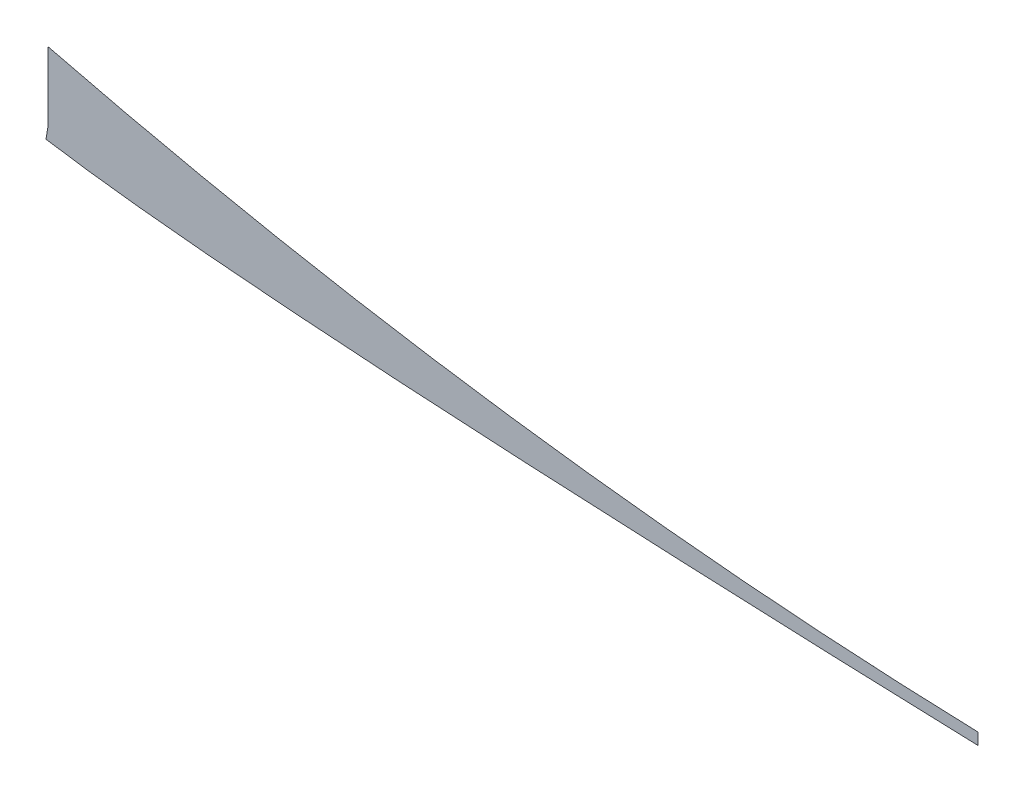
ISO-10303-21;
HEADER;
FILE_DESCRIPTION(('STEP AP214'),'2;1');
FILE_NAME('part.step','',(''),(''),'','','');
FILE_SCHEMA(('AUTOMOTIVE_DESIGN { 1 0 10303 214 1 1 1 1 }'));
ENDSEC;
DATA;
#1=APPLICATION_CONTEXT('core data for automotive mechanical design processes');
#2=APPLICATION_PROTOCOL_DEFINITION('international standard','automotive_design',2000,#1);
#3=PRODUCT_CONTEXT('',#1,'mechanical');
#4=PRODUCT('Part','Part','',(#3));
#5=PRODUCT_RELATED_PRODUCT_CATEGORY('part','',(#4));
#6=PRODUCT_DEFINITION_FORMATION('','',#4);
#7=PRODUCT_DEFINITION_CONTEXT('part definition',#1,'design');
#8=PRODUCT_DEFINITION('design','',#6,#7);
#9=PRODUCT_DEFINITION_SHAPE('','',#8);
#10=(LENGTH_UNIT() NAMED_UNIT(*) SI_UNIT(.MILLI.,.METRE.));
#11=(NAMED_UNIT(*) PLANE_ANGLE_UNIT() SI_UNIT($,.RADIAN.));
#12=(NAMED_UNIT(*) SI_UNIT($,.STERADIAN.) SOLID_ANGLE_UNIT());
#13=UNCERTAINTY_MEASURE_WITH_UNIT(LENGTH_MEASURE(1.E-05),#10,'distance_accuracy_value','');
#14=(GEOMETRIC_REPRESENTATION_CONTEXT(3) GLOBAL_UNCERTAINTY_ASSIGNED_CONTEXT((#13)) GLOBAL_UNIT_ASSIGNED_CONTEXT((#10,
#11,#12)) REPRESENTATION_CONTEXT('',''));
#15=CARTESIAN_POINT('',(0.,0.,0.));
#16=DIRECTION('',(0.,0.,1.));
#17=DIRECTION('',(1.,0.,0.));
#18=AXIS2_PLACEMENT_3D('',#15,#16,#17);
#19=CARTESIAN_POINT('',(-2508.02440172636,0.,0.0001778));
#20=DIRECTION('',(1.,0.,0.));
#21=DIRECTION('',(0.,0.,-1.));
#22=AXIS2_PLACEMENT_3D('',#19,#20,#21);
#23=PLANE('',#22);
#24=DIRECTION('',(0.,-1.,0.));
#25=VECTOR('',#24,1.);
#26=CARTESIAN_POINT('',(-2508.02440172636,0.,0.));
#27=LINE('',#26,#25);
#28=CARTESIAN_POINT('',(-2508.02440172636,162.016184250912,0.));
#29=VERTEX_POINT('',#28);
#30=CARTESIAN_POINT('',(-2508.02440172636,12.016184250912,0.));
#31=VERTEX_POINT('',#30);
#32=EDGE_CURVE('E115',#29,#31,#27,.T.);
#33=ORIENTED_EDGE('',*,*,#32,.T.);
#34=DIRECTION('',(0.,0.,-1.));
#35=VECTOR('',#34,1.);
#36=CARTESIAN_POINT('',(-2508.02440172636,12.016184250912,0.0001778));
#37=LINE('',#36,#35);
#38=CARTESIAN_POINT('',(-2508.02440172636,12.016184250912,0.0001778));
#39=VERTEX_POINT('',#38);
#40=EDGE_CURVE('E11',#39,#31,#37,.T.);
#41=ORIENTED_EDGE('',*,*,#40,.F.);
#42=DIRECTION('',(0.,-1.,0.));
#43=VECTOR('',#42,1.);
#44=CARTESIAN_POINT('',(-2508.02440172636,0.,0.0001778));
#45=LINE('',#44,#43);
#46=CARTESIAN_POINT('',(-2508.02440172636,162.016184250912,0.0001778));
#47=VERTEX_POINT('',#46);
#48=EDGE_CURVE('E129',#47,#39,#45,.T.);
#49=ORIENTED_EDGE('',*,*,#48,.F.);
#50=DIRECTION('',(0.,0.,-1.));
#51=VECTOR('',#50,1.);
#52=CARTESIAN_POINT('',(-2508.02440172636,162.016184250912,0.0001778));
#53=LINE('',#52,#51);
#54=EDGE_CURVE('E108',#47,#29,#53,.T.);
#55=ORIENTED_EDGE('',*,*,#54,.T.);
#56=EDGE_LOOP('',(#33,#41,#49,#55));
#57=FACE_BOUND('',#56,.T.);
#58=ADVANCED_FACE('F39',(#57),#23,.F.);
#59=CARTESIAN_POINT('',(-2445.12301211132,398.229626991284,0.0001778));
#60=DIRECTION('',(0.986995338193962,-0.160748879882213,0.));
#61=DIRECTION('',(0.160748879882213,0.986995338193962,0.));
#62=AXIS2_PLACEMENT_3D('',#59,#60,#61);
#63=PLANE('',#62);
#64=DIRECTION('',(-0.160748879882213,-0.986995338193962,0.));
#65=VECTOR('',#64,1.);
#66=CARTESIAN_POINT('',(-2445.12301211132,398.229626991284,0.));
#67=LINE('',#66,#65);
#68=CARTESIAN_POINT('',(-2512.04312372342,-12.6586992039371,0.));
#69=VERTEX_POINT('',#68);
#70=EDGE_CURVE('E118',#31,#69,#67,.T.);
#71=ORIENTED_EDGE('',*,*,#70,.T.);
#72=DIRECTION('',(0.,0.,-1.));
#73=VECTOR('',#72,1.);
#74=CARTESIAN_POINT('',(-2512.04312372342,-12.6586992039371,0.0001778));
#75=LINE('',#74,#73);
#76=CARTESIAN_POINT('',(-2512.04312372342,-12.6586992039371,0.0001778));
#77=VERTEX_POINT('',#76);
#78=EDGE_CURVE('E47',#77,#69,#75,.T.);
#79=ORIENTED_EDGE('',*,*,#78,.F.);
#80=DIRECTION('',(-0.160748879882213,-0.986995338193962,0.));
#81=VECTOR('',#80,1.);
#82=CARTESIAN_POINT('',(-2445.12301211132,398.229626991284,0.0001778));
#83=LINE('',#82,#81);
#84=EDGE_CURVE('E85',#39,#77,#83,.T.);
#85=ORIENTED_EDGE('',*,*,#84,.F.);
#86=ORIENTED_EDGE('',*,*,#40,.T.);
#87=EDGE_LOOP('',(#71,#79,#85,#86));
#88=FACE_BOUND('',#87,.T.);
#89=ADVANCED_FACE('F148',(#88),#63,.F.);
#90=CARTESIAN_POINT('',(-2512.04312372342,-12.6586992039371,0.0001778));
#91=CARTESIAN_POINT('',(-2510.05451610875,-12.9825775792576,0.0001778));
#92=CARTESIAN_POINT('',(-2506.0913865952,-13.6229233705499,0.0001778));
#93=CARTESIAN_POINT('',(-2498.04275967752,-14.9032191450861,0.0001778));
#94=CARTESIAN_POINT('',(-2487.83614916886,-16.4894931862188,0.0001778));
#95=CARTESIAN_POINT('',(-2475.33243770545,-18.3749601126837,0.0001778));
#96=CARTESIAN_POINT('',(-2458.33363162585,-20.863671926,0.0001778));
#97=CARTESIAN_POINT('',(-2436.4762020029,-23.928516792383,0.0001778));
#98=CARTESIAN_POINT('',(-2409.30293595711,-27.5341707306932,0.0001778));
#99=CARTESIAN_POINT('',(-2381.21401835691,-31.0692701334651,0.0001778));
#100=CARTESIAN_POINT('',(-2342.580611439,-35.6905273236185,0.0001778));
#101=CARTESIAN_POINT('',(-2292.14757914058,-41.2975417492381,0.0001778));
#102=CARTESIAN_POINT('',(-2228.44208922003,-47.7643317876776,0.0001778));
#103=CARTESIAN_POINT('',(-2161.79356602486,-53.9783404822711,0.0001778));
#104=CARTESIAN_POINT('',(-2092.44672883574,-59.9479104873161,0.0001778));
#105=CARTESIAN_POINT('',(-1996.71919848474,-67.5926728562654,0.0001778));
#106=CARTESIAN_POINT('',(-1871.56309346944,-76.5793157430295,0.0001778));
#107=CARTESIAN_POINT('',(-1714.56859667655,-86.5175926441486,0.0001778));
#108=CARTESIAN_POINT('',(-1552.76161852461,-95.6740110472878,0.0001778));
#109=CARTESIAN_POINT('',(-1388.10747504773,-104.112588093494,0.0001778));
#110=CARTESIAN_POINT('',(-1250.13879496344,-110.599471349717,0.0001778));
#111=CARTESIAN_POINT('',(-1140.26074711498,-115.493320110871,0.0001778));
#112=CARTESIAN_POINT('',(-1058.3256191277,-119.024475959551,0.0001778));
#113=CARTESIAN_POINT('',(-977.053458684462,-122.426989504452,0.0001778));
#114=CARTESIAN_POINT('',(-897.242215663593,-125.674158083226,0.0001778));
#115=CARTESIAN_POINT('',(-818.712690961929,-128.759488747918,0.0001778));
#116=CARTESIAN_POINT('',(-715.554683807939,-132.650116292441,0.0001778));
#117=CARTESIAN_POINT('',(-589.249590679601,-137.080108778825,0.0001778));
#118=CARTESIAN_POINT('',(-441.110930622203,-141.649434999875,0.0001778));
#119=CARTESIAN_POINT('',(-295.695003647712,-145.410785116849,0.0001778));
#120=CARTESIAN_POINT('',(-152.356622959119,-148.296496330385,0.0001778));
#121=CARTESIAN_POINT('',(-10.4989219153358,-150.218189421829,0.0001778));
#122=CARTESIAN_POINT('',(130.475199862908,-151.088124067607,0.0001778));
#123=CARTESIAN_POINT('',(271.17608563604,-150.779794024414,0.0001778));
#124=CARTESIAN_POINT('',(412.209973938585,-149.166562233703,0.0001778));
#125=CARTESIAN_POINT('',(554.265352606415,-146.076517589065,0.0001778));
#126=CARTESIAN_POINT('',(698.109772524448,-141.299771893809,0.0001778));
#127=CARTESIAN_POINT('',(820.229150888678,-135.691466999975,0.0001778));
#128=CARTESIAN_POINT('',(913.268144556853,-130.426141546415,0.0001778));
#129=CARTESIAN_POINT('',(957.076629108227,-127.661045547463,0.0001778));
#130=CARTESIAN_POINT('',(975.767433575463,-126.427475119643,0.0001778));
#131=B_SPLINE_CURVE_WITH_KNOTS('',3,(#90,#91,#92,#93,#94,#95,#96,#97,#98,#99,#100,#101,#102,
#103,#104,#105,#106,#107,#108,#109,#110,#111,#112,#113,#114,#115,#116,#117,#118,#119,#120,#121,
#122,#123,#124,#125,#126,#127,#128,#129,#130),.UNSPECIFIED.,.F.,.F.,(4,1,1,1,1,1,1,1,1,1,1,1,1,
1,1,1,1,1,1,1,1,1,1,1,1,1,1,1,1,1,1,1,1,1,1,1,1,1,4),(0.255847656824114,0.257796247110181,
0.259744837396247,0.26364201796838,0.267539198540513,0.271436379112646,0.279230740256912,
0.287025101401178,0.294819462545444,0.30261382368971,0.318202545978242,0.333791268266774,
0.349379990555306,0.364968712843839,0.380557435132371,0.411734879709435,0.442912324286499,
0.474089768863563,0.505267213440627,0.536444658017691,0.552033380306223,0.567622102594755,
0.583210824883287,0.598799547171819,0.614388269460351,0.629976991748883,0.661154436325947,
0.692331880903011,0.723509325480076,0.75468677005714,0.785864214634204,0.817041659211268,
0.848219103788332,0.879396548365396,0.91057399294246,0.941751437519524,0.972928882096588,
0.98851760438512,1.),.UNSPECIFIED.);
#132=DIRECTION('',(0.,0.,-1.));
#133=VECTOR('',#132,1.);
#134=SURFACE_OF_LINEAR_EXTRUSION('',#131,#133);
#135=CARTESIAN_POINT('',(-2512.04312372342,-12.6586992039371,0.));
#136=CARTESIAN_POINT('',(-2510.05451610875,-12.9825775792576,0.));
#137=CARTESIAN_POINT('',(-2506.0913865952,-13.6229233705499,0.));
#138=CARTESIAN_POINT('',(-2498.04275967752,-14.9032191450861,0.));
#139=CARTESIAN_POINT('',(-2487.83614916886,-16.4894931862188,0.));
#140=CARTESIAN_POINT('',(-2475.33243770545,-18.3749601126837,0.));
#141=CARTESIAN_POINT('',(-2458.33363162585,-20.863671926,0.));
#142=CARTESIAN_POINT('',(-2436.4762020029,-23.928516792383,0.));
#143=CARTESIAN_POINT('',(-2409.30293595711,-27.5341707306932,0.));
#144=CARTESIAN_POINT('',(-2381.21401835691,-31.0692701334651,0.));
#145=CARTESIAN_POINT('',(-2342.580611439,-35.6905273236185,0.));
#146=CARTESIAN_POINT('',(-2292.14757914058,-41.2975417492381,0.));
#147=CARTESIAN_POINT('',(-2228.44208922003,-47.7643317876776,0.));
#148=CARTESIAN_POINT('',(-2161.79356602486,-53.9783404822711,0.));
#149=CARTESIAN_POINT('',(-2092.44672883574,-59.9479104873161,0.));
#150=CARTESIAN_POINT('',(-1996.71919848474,-67.5926728562654,0.));
#151=CARTESIAN_POINT('',(-1871.56309346944,-76.5793157430295,0.));
#152=CARTESIAN_POINT('',(-1714.56859667655,-86.5175926441486,0.));
#153=CARTESIAN_POINT('',(-1552.76161852461,-95.6740110472878,0.));
#154=CARTESIAN_POINT('',(-1388.10747504773,-104.112588093494,0.));
#155=CARTESIAN_POINT('',(-1250.13879496344,-110.599471349717,0.));
#156=CARTESIAN_POINT('',(-1140.26074711498,-115.493320110871,0.));
#157=CARTESIAN_POINT('',(-1058.3256191277,-119.024475959551,0.));
#158=CARTESIAN_POINT('',(-977.053458684462,-122.426989504452,0.));
#159=CARTESIAN_POINT('',(-897.242215663593,-125.674158083226,0.));
#160=CARTESIAN_POINT('',(-818.712690961929,-128.759488747918,0.));
#161=CARTESIAN_POINT('',(-715.554683807939,-132.650116292441,0.));
#162=CARTESIAN_POINT('',(-589.249590679601,-137.080108778825,0.));
#163=CARTESIAN_POINT('',(-441.110930622203,-141.649434999875,0.));
#164=CARTESIAN_POINT('',(-295.695003647712,-145.410785116849,0.));
#165=CARTESIAN_POINT('',(-152.356622959119,-148.296496330385,0.));
#166=CARTESIAN_POINT('',(-10.4989219153358,-150.218189421829,0.));
#167=CARTESIAN_POINT('',(130.475199862908,-151.088124067607,0.));
#168=CARTESIAN_POINT('',(271.17608563604,-150.779794024414,0.));
#169=CARTESIAN_POINT('',(412.209973938585,-149.166562233703,0.));
#170=CARTESIAN_POINT('',(554.265352606415,-146.076517589065,0.));
#171=CARTESIAN_POINT('',(698.109772524448,-141.299771893809,0.));
#172=CARTESIAN_POINT('',(820.229150888678,-135.691466999975,0.));
#173=CARTESIAN_POINT('',(913.268144556853,-130.426141546415,0.));
#174=CARTESIAN_POINT('',(957.076629108227,-127.661045547463,0.));
#175=CARTESIAN_POINT('',(975.767433575463,-126.427475119643,0.));
#176=B_SPLINE_CURVE_WITH_KNOTS('',3,(#135,#136,#137,#138,#139,#140,#141,#142,#143,#144,#145,
#146,#147,#148,#149,#150,#151,#152,#153,#154,#155,#156,#157,#158,#159,#160,#161,#162,#163,#164,
#165,#166,#167,#168,#169,#170,#171,#172,#173,#174,#175),.UNSPECIFIED.,.F.,.F.,(4,1,1,1,1,1,1,1,
1,1,1,1,1,1,1,1,1,1,1,1,1,1,1,1,1,1,1,1,1,1,1,1,1,1,1,1,1,1,4),(0.255847656824114,
0.257796247110181,0.259744837396247,0.26364201796838,0.267539198540513,0.271436379112646,
0.279230740256912,0.287025101401178,0.294819462545444,0.30261382368971,0.318202545978242,
0.333791268266774,0.349379990555306,0.364968712843839,0.380557435132371,0.411734879709435,
0.442912324286499,0.474089768863563,0.505267213440627,0.536444658017691,0.552033380306223,
0.567622102594755,0.583210824883287,0.598799547171819,0.614388269460351,0.629976991748883,
0.661154436325947,0.692331880903011,0.723509325480076,0.75468677005714,0.785864214634204,
0.817041659211268,0.848219103788332,0.879396548365396,0.91057399294246,0.941751437519524,
0.972928882096588,0.98851760438512,1.),.UNSPECIFIED.);
#177=CARTESIAN_POINT('',(-508.02440172636,-139.55572071554,0.));
#178=VERTEX_POINT('',#177);
#179=EDGE_CURVE('E101',#69,#178,#176,.T.);
#180=ORIENTED_EDGE('',*,*,#179,.T.);
#181=DIRECTION('',(0.,0.,-1.));
#182=VECTOR('',#181,1.);
#183=CARTESIAN_POINT('',(-508.02440172636,-139.55572071554,0.0001778));
#184=LINE('',#183,#182);
#185=CARTESIAN_POINT('',(-508.02440172636,-139.55572071554,0.0001778));
#186=VERTEX_POINT('',#185);
#187=EDGE_CURVE('E98',#186,#178,#184,.T.);
#188=ORIENTED_EDGE('',*,*,#187,.F.);
#189=EDGE_CURVE('E89',#77,#186,#131,.T.);
#190=ORIENTED_EDGE('',*,*,#189,.F.);
#191=ORIENTED_EDGE('',*,*,#78,.T.);
#192=EDGE_LOOP('',(#180,#188,#190,#191));
#193=FACE_BOUND('',#192,.T.);
#194=ADVANCED_FACE('F99',(#193),#134,.F.);
#195=CARTESIAN_POINT('',(-508.024401726362,-4.51005698595196E-12,0.0001778));
#196=DIRECTION('',(1.,0.,0.));
#197=DIRECTION('',(0.,1.,0.));
#198=AXIS2_PLACEMENT_3D('',#195,#196,#197);
#199=PLANE('',#198);
#200=DIRECTION('',(0.,-1.,0.));
#201=VECTOR('',#200,1.);
#202=CARTESIAN_POINT('',(-508.024401726362,-4.51005698595196E-12,0.));
#203=LINE('',#202,#201);
#204=CARTESIAN_POINT('',(-508.024401726361,-114.544046156888,0.));
#205=VERTEX_POINT('',#204);
#206=EDGE_CURVE('E123',#205,#178,#203,.T.);
#207=ORIENTED_EDGE('',*,*,#206,.F.);
#208=DIRECTION('',(0.,0.,-1.));
#209=VECTOR('',#208,1.);
#210=CARTESIAN_POINT('',(-508.024401726361,-114.544046156888,0.0001778));
#211=LINE('',#210,#209);
#212=CARTESIAN_POINT('',(-508.024401726361,-114.544046156888,0.0001778));
#213=VERTEX_POINT('',#212);
#214=EDGE_CURVE('E74',#213,#205,#211,.T.);
#215=ORIENTED_EDGE('',*,*,#214,.F.);
#216=DIRECTION('',(0.,-1.,0.));
#217=VECTOR('',#216,1.);
#218=CARTESIAN_POINT('',(-508.024401726362,-4.51005698595196E-12,0.0001778));
#219=LINE('',#218,#217);
#220=EDGE_CURVE('E93',#213,#186,#219,.T.);
#221=ORIENTED_EDGE('',*,*,#220,.T.);
#222=ORIENTED_EDGE('',*,*,#187,.T.);
#223=EDGE_LOOP('',(#207,#215,#221,#222));
#224=FACE_BOUND('',#223,.T.);
#225=ADVANCED_FACE('F106',(#224),#199,.T.);
#226=CARTESIAN_POINT('',(-218.761744457914,9347.29394551656,0.0001778));
#227=DIRECTION('',(0.,0.,-1.));
#228=DIRECTION('',(-1.,0.,0.));
#229=AXIS2_PLACEMENT_3D('',#226,#227,#228);
#230=CYLINDRICAL_SURFACE('',#229,9466.25855687267);
#231=CARTESIAN_POINT('',(-218.761744457914,9347.29394551656,0.));
#232=DIRECTION('',(0.,0.,1.));
#233=DIRECTION('',(1.,0.,0.));
#234=AXIS2_PLACEMENT_3D('',#231,#232,#233);
#235=CIRCLE('',#234,9466.25855687267);
#236=EDGE_CURVE('E77',#205,#29,#235,.F.);
#237=ORIENTED_EDGE('',*,*,#236,.T.);
#238=ORIENTED_EDGE('',*,*,#54,.F.);
#239=CARTESIAN_POINT('',(-218.761744457914,9347.29394551656,0.0001778));
#240=DIRECTION('',(0.,0.,1.));
#241=DIRECTION('',(1.,0.,0.));
#242=AXIS2_PLACEMENT_3D('',#239,#240,#241);
#243=CIRCLE('',#242,9466.25855687267);
#244=EDGE_CURVE('E55',#213,#47,#243,.F.);
#245=ORIENTED_EDGE('',*,*,#244,.F.);
#246=ORIENTED_EDGE('',*,*,#214,.T.);
#247=EDGE_LOOP('',(#237,#238,#245,#246));
#248=FACE_BOUND('',#247,.T.);
#249=ADVANCED_FACE('F137',(#248),#230,.F.);
#250=CARTESIAN_POINT('',(0.,0.,0.0001778));
#251=DIRECTION('',(0.,0.,1.));
#252=DIRECTION('',(1.,0.,0.));
#253=AXIS2_PLACEMENT_3D('',#250,#251,#252);
#254=PLANE('',#253);
#255=ORIENTED_EDGE('',*,*,#48,.T.);
#256=ORIENTED_EDGE('',*,*,#84,.T.);
#257=ORIENTED_EDGE('',*,*,#189,.T.);
#258=ORIENTED_EDGE('',*,*,#220,.F.);
#259=ORIENTED_EDGE('',*,*,#244,.T.);
#260=EDGE_LOOP('',(#255,#256,#257,#258,#259));
#261=FACE_BOUND('',#260,.T.);
#262=ADVANCED_FACE('F91',(#261),#254,.T.);
#263=CARTESIAN_POINT('',(0.,0.,0.));
#264=DIRECTION('',(0.,0.,1.));
#265=DIRECTION('',(1.,0.,0.));
#266=AXIS2_PLACEMENT_3D('',#263,#264,#265);
#267=PLANE('',#266);
#268=ORIENTED_EDGE('',*,*,#32,.F.);
#269=ORIENTED_EDGE('',*,*,#236,.F.);
#270=ORIENTED_EDGE('',*,*,#206,.T.);
#271=ORIENTED_EDGE('',*,*,#179,.F.);
#272=ORIENTED_EDGE('',*,*,#70,.F.);
#273=EDGE_LOOP('',(#268,#269,#270,#271,#272));
#274=FACE_BOUND('',#273,.T.);
#275=ADVANCED_FACE('F133',(#274),#267,.F.);
#276=CLOSED_SHELL('',(#58,#89,#194,#225,#249,#262,#275));
#277=MANIFOLD_SOLID_BREP('B2',#276);
#278=ADVANCED_BREP_SHAPE_REPRESENTATION('',(#18,#277),#14);
#279=SHAPE_DEFINITION_REPRESENTATION(#9,#278);
ENDSEC;
END-ISO-10303-21;
